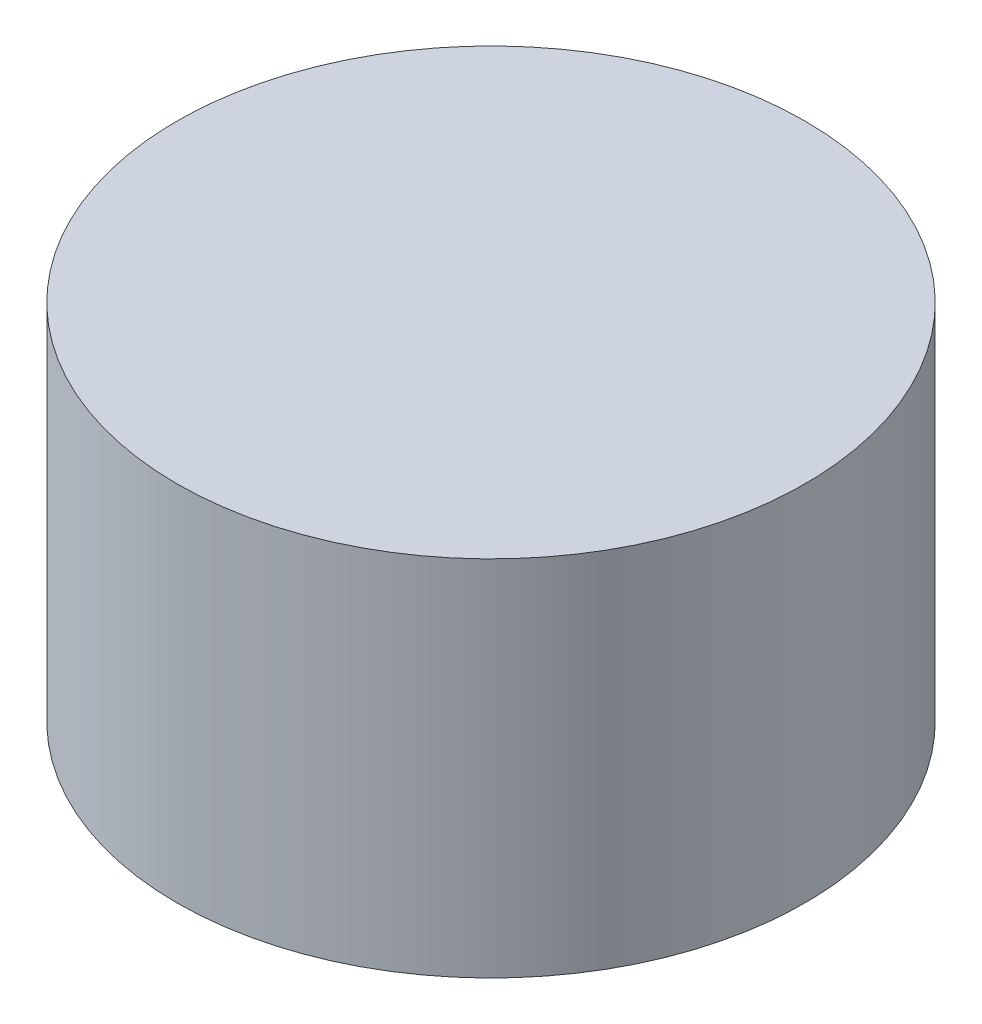
ISO-10303-21;
HEADER;
FILE_DESCRIPTION(('STEP AP214'),'2;1');
FILE_NAME('part.step','',(''),(''),'','','');
FILE_SCHEMA(('AUTOMOTIVE_DESIGN { 1 0 10303 214 1 1 1 1 }'));
ENDSEC;
DATA;
#1=APPLICATION_CONTEXT('core data for automotive mechanical design processes');
#2=APPLICATION_PROTOCOL_DEFINITION('international standard','automotive_design',2000,#1);
#3=PRODUCT_CONTEXT('',#1,'mechanical');
#4=PRODUCT('Part','Part','',(#3));
#5=PRODUCT_RELATED_PRODUCT_CATEGORY('part','',(#4));
#6=PRODUCT_DEFINITION_FORMATION('','',#4);
#7=PRODUCT_DEFINITION_CONTEXT('part definition',#1,'design');
#8=PRODUCT_DEFINITION('design','',#6,#7);
#9=PRODUCT_DEFINITION_SHAPE('','',#8);
#10=(LENGTH_UNIT() NAMED_UNIT(*) SI_UNIT(.MILLI.,.METRE.));
#11=(NAMED_UNIT(*) PLANE_ANGLE_UNIT() SI_UNIT($,.RADIAN.));
#12=(NAMED_UNIT(*) SI_UNIT($,.STERADIAN.) SOLID_ANGLE_UNIT());
#13=UNCERTAINTY_MEASURE_WITH_UNIT(LENGTH_MEASURE(1.E-05),#10,'distance_accuracy_value','');
#14=(GEOMETRIC_REPRESENTATION_CONTEXT(3) GLOBAL_UNCERTAINTY_ASSIGNED_CONTEXT((#13)) GLOBAL_UNIT_ASSIGNED_CONTEXT((#10,
#11,#12)) REPRESENTATION_CONTEXT('',''));
#15=CARTESIAN_POINT('',(0.,0.,0.));
#16=DIRECTION('',(0.,0.,1.));
#17=DIRECTION('',(1.,0.,0.));
#18=AXIS2_PLACEMENT_3D('',#15,#16,#17);
#19=CARTESIAN_POINT('',(0.,52.,0.));
#20=DIRECTION('',(0.,-1.,0.));
#21=DIRECTION('',(0.,0.,-1.));
#22=AXIS2_PLACEMENT_3D('',#19,#20,#21);
#23=CYLINDRICAL_SURFACE('',#22,45.);
#24=CARTESIAN_POINT('',(0.,52.,0.));
#25=DIRECTION('',(0.,1.,0.));
#26=DIRECTION('',(0.,0.,1.));
#27=AXIS2_PLACEMENT_3D('',#24,#25,#26);
#28=CIRCLE('',#27,45.);
#29=CARTESIAN_POINT('',(0.,52.,-45.));
#30=VERTEX_POINT('',#29);
#31=EDGE_CURVE('E10',#30,#30,#28,.T.);
#32=CARTESIAN_POINT('',(0.,0.,0.));
#33=DIRECTION('',(0.,1.,0.));
#34=DIRECTION('',(0.,0.,1.));
#35=AXIS2_PLACEMENT_3D('',#32,#33,#34);
#36=CIRCLE('',#35,45.);
#37=CARTESIAN_POINT('',(0.,0.,-45.));
#38=VERTEX_POINT('',#37);
#39=EDGE_CURVE('E36',#38,#38,#36,.T.);
#40=CARTESIAN_POINT('',(0.,52.,-45.));
#41=CARTESIAN_POINT('',(0.,51.4583333333333,-45.));
#42=CARTESIAN_POINT('',(0.,50.9166666666667,-45.));
#43=CARTESIAN_POINT('',(0.,49.8333333333333,-45.));
#44=CARTESIAN_POINT('',(0.,49.2916666666667,-45.));
#45=CARTESIAN_POINT('',(0.,48.2083333333333,-45.));
#46=CARTESIAN_POINT('',(0.,47.6666666666667,-45.));
#47=CARTESIAN_POINT('',(0.,46.5833333333333,-45.));
#48=CARTESIAN_POINT('',(0.,46.0416666666667,-45.));
#49=CARTESIAN_POINT('',(0.,44.9583333333333,-45.));
#50=CARTESIAN_POINT('',(0.,44.4166666666667,-45.));
#51=CARTESIAN_POINT('',(0.,43.3333333333333,-45.));
#52=CARTESIAN_POINT('',(0.,42.7916666666667,-45.));
#53=CARTESIAN_POINT('',(0.,41.7083333333333,-45.));
#54=CARTESIAN_POINT('',(0.,41.1666666666667,-45.));
#55=CARTESIAN_POINT('',(0.,40.0833333333333,-45.));
#56=CARTESIAN_POINT('',(0.,39.5416666666667,-45.));
#57=CARTESIAN_POINT('',(0.,38.4583333333333,-45.));
#58=CARTESIAN_POINT('',(0.,37.9166666666667,-45.));
#59=CARTESIAN_POINT('',(0.,36.8333333333333,-45.));
#60=CARTESIAN_POINT('',(0.,36.2916666666667,-45.));
#61=CARTESIAN_POINT('',(0.,35.2083333333333,-45.));
#62=CARTESIAN_POINT('',(0.,34.6666666666667,-45.));
#63=CARTESIAN_POINT('',(0.,33.5833333333333,-45.));
#64=CARTESIAN_POINT('',(0.,33.0416666666667,-45.));
#65=CARTESIAN_POINT('',(0.,31.9583333333333,-45.));
#66=CARTESIAN_POINT('',(0.,31.4166666666667,-45.));
#67=CARTESIAN_POINT('',(0.,30.3333333333333,-45.));
#68=CARTESIAN_POINT('',(0.,29.7916666666667,-45.));
#69=CARTESIAN_POINT('',(0.,28.7083333333333,-45.));
#70=CARTESIAN_POINT('',(0.,28.1666666666667,-45.));
#71=CARTESIAN_POINT('',(0.,27.0833333333333,-45.));
#72=CARTESIAN_POINT('',(0.,26.5416666666667,-45.));
#73=CARTESIAN_POINT('',(0.,25.4583333333333,-45.));
#74=CARTESIAN_POINT('',(0.,24.9166666666667,-45.));
#75=CARTESIAN_POINT('',(0.,23.8333333333333,-45.));
#76=CARTESIAN_POINT('',(0.,23.2916666666667,-45.));
#77=CARTESIAN_POINT('',(0.,22.2083333333333,-45.));
#78=CARTESIAN_POINT('',(0.,21.6666666666667,-45.));
#79=CARTESIAN_POINT('',(0.,20.5833333333333,-45.));
#80=CARTESIAN_POINT('',(0.,20.0416666666667,-45.));
#81=CARTESIAN_POINT('',(0.,18.9583333333333,-45.));
#82=CARTESIAN_POINT('',(0.,18.4166666666667,-45.));
#83=CARTESIAN_POINT('',(0.,17.3333333333333,-45.));
#84=CARTESIAN_POINT('',(0.,16.7916666666667,-45.));
#85=CARTESIAN_POINT('',(0.,15.7083333333333,-45.));
#86=CARTESIAN_POINT('',(0.,15.1666666666667,-45.));
#87=CARTESIAN_POINT('',(0.,14.0833333333333,-45.));
#88=CARTESIAN_POINT('',(0.,13.5416666666667,-45.));
#89=CARTESIAN_POINT('',(0.,12.4583333333333,-45.));
#90=CARTESIAN_POINT('',(0.,11.9166666666667,-45.));
#91=CARTESIAN_POINT('',(0.,10.8333333333333,-45.));
#92=CARTESIAN_POINT('',(0.,10.2916666666667,-45.));
#93=CARTESIAN_POINT('',(0.,9.20833333333333,-45.));
#94=CARTESIAN_POINT('',(0.,8.66666666666667,-45.));
#95=CARTESIAN_POINT('',(0.,7.58333333333333,-45.));
#96=CARTESIAN_POINT('',(0.,7.04166666666667,-45.));
#97=CARTESIAN_POINT('',(0.,5.95833333333333,-45.));
#98=CARTESIAN_POINT('',(0.,5.41666666666667,-45.));
#99=CARTESIAN_POINT('',(0.,4.33333333333333,-45.));
#100=CARTESIAN_POINT('',(0.,3.79166666666667,-45.));
#101=CARTESIAN_POINT('',(0.,2.70833333333334,-45.));
#102=CARTESIAN_POINT('',(0.,2.16666666666667,-45.));
#103=CARTESIAN_POINT('',(0.,1.08333333333333,-45.));
#104=CARTESIAN_POINT('',(0.,0.541666666666667,-45.));
#105=CARTESIAN_POINT('',(0.,0.,-45.));
#106=B_SPLINE_CURVE_WITH_KNOTS('',3,(#40,#41,#42,#43,#44,#45,#46,#47,#48,#49,#50,#51,#52,#53,
#54,#55,#56,#57,#58,#59,#60,#61,#62,#63,#64,#65,#66,#67,#68,#69,#70,#71,#72,#73,#74,#75,#76,#77,
#78,#79,#80,#81,#82,#83,#84,#85,#86,#87,#88,#89,#90,#91,#92,#93,#94,#95,#96,#97,#98,#99,#100,
#101,#102,#103,#104,#105),.UNSPECIFIED.,.F.,.F.,(4,2,2,2,2,2,2,2,2,2,2,2,2,2,2,2,2,2,2,2,2,2,2,
2,2,2,2,2,2,2,2,2,4),(0.,1.62499999999999,3.25,4.875,6.49999999999999,8.12499999999999,
9.74999999999999,11.375,13.,14.625,16.25,17.875,19.5,21.125,22.75,24.375,26.,27.625,29.25,
30.875,32.5,34.125,35.75,37.375,39.,40.625,42.25,43.875,45.5,47.125,48.75,50.375,52.),.UNSPECIFIED.);
#107=EDGE_CURVE('BSEAM33',#30,#38,#106,.T.);
#108=ORIENTED_EDGE('',*,*,#31,.F.);
#109=ORIENTED_EDGE('',*,*,#39,.T.);
#110=ORIENTED_EDGE('',*,*,#107,.T.);
#111=ORIENTED_EDGE('',*,*,#107,.F.);
#112=EDGE_LOOP('',(#108,#110,#109,#111));
#113=FACE_BOUND('',#112,.T.);
#114=ADVANCED_FACE('F33',(#113),#23,.T.);
#115=CARTESIAN_POINT('',(0.,52.,0.));
#116=DIRECTION('',(0.,1.,0.));
#117=DIRECTION('',(0.,0.,1.));
#118=AXIS2_PLACEMENT_3D('',#115,#116,#117);
#119=PLANE('',#118);
#120=ORIENTED_EDGE('',*,*,#31,.T.);
#121=EDGE_LOOP('',(#120));
#122=FACE_BOUND('',#121,.T.);
#123=ADVANCED_FACE('F48',(#122),#119,.T.);
#124=CARTESIAN_POINT('',(0.,0.,0.));
#125=DIRECTION('',(0.,1.,0.));
#126=DIRECTION('',(0.,0.,1.));
#127=AXIS2_PLACEMENT_3D('',#124,#125,#126);
#128=PLANE('',#127);
#129=ORIENTED_EDGE('',*,*,#39,.F.);
#130=EDGE_LOOP('',(#129));
#131=FACE_BOUND('',#130,.T.);
#132=ADVANCED_FACE('F46',(#131),#128,.F.);
#133=CLOSED_SHELL('',(#114,#123,#132));
#134=MANIFOLD_SOLID_BREP('B2',#133);
#135=ADVANCED_BREP_SHAPE_REPRESENTATION('',(#18,#134),#14);
#136=SHAPE_DEFINITION_REPRESENTATION(#9,#135);
ENDSEC;
END-ISO-10303-21;
